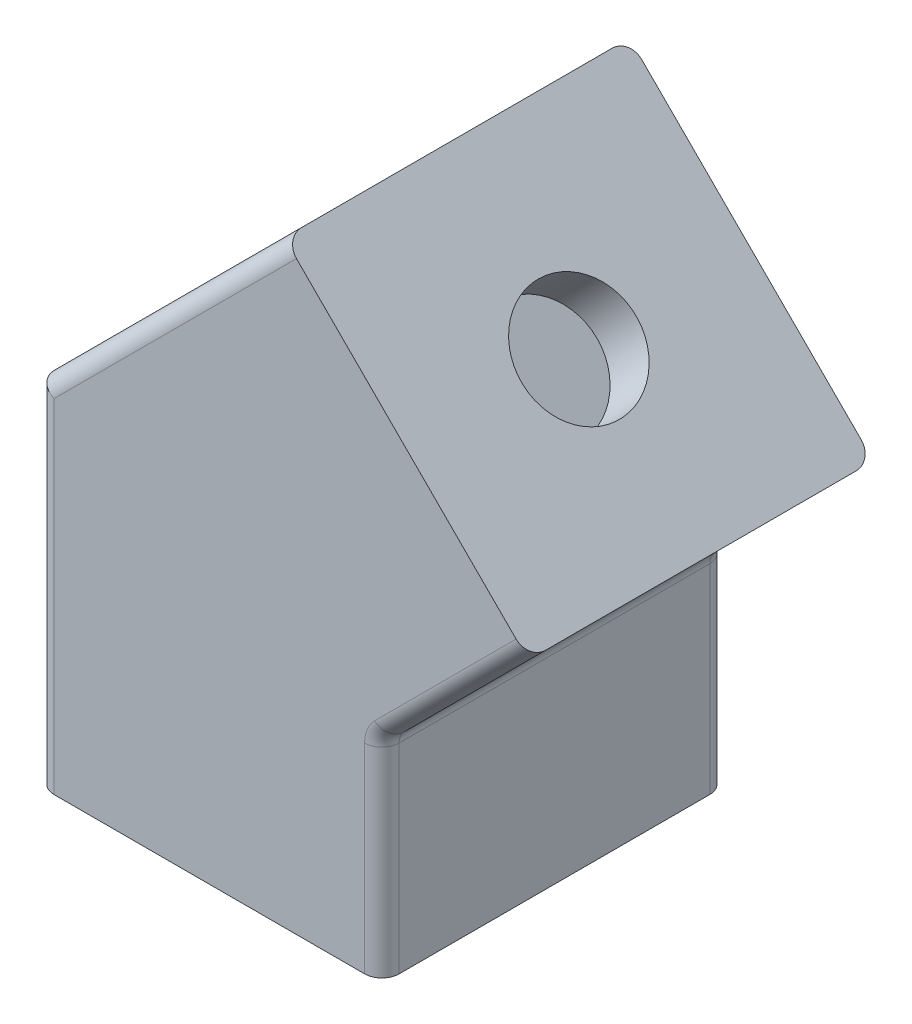
ISO-10303-21;
HEADER;
FILE_DESCRIPTION(('STEP AP214'),'2;1');
FILE_NAME('part.step','',(''),(''),'','','');
FILE_SCHEMA(('AUTOMOTIVE_DESIGN { 1 0 10303 214 1 1 1 1 }'));
ENDSEC;
DATA;
#1=APPLICATION_CONTEXT('core data for automotive mechanical design processes');
#2=APPLICATION_PROTOCOL_DEFINITION('international standard','automotive_design',2000,#1);
#3=PRODUCT_CONTEXT('',#1,'mechanical');
#4=PRODUCT('Part','Part','',(#3));
#5=PRODUCT_RELATED_PRODUCT_CATEGORY('part','',(#4));
#6=PRODUCT_DEFINITION_FORMATION('','',#4);
#7=PRODUCT_DEFINITION_CONTEXT('part definition',#1,'design');
#8=PRODUCT_DEFINITION('design','',#6,#7);
#9=PRODUCT_DEFINITION_SHAPE('','',#8);
#10=(LENGTH_UNIT() NAMED_UNIT(*) SI_UNIT(.MILLI.,.METRE.));
#11=(NAMED_UNIT(*) PLANE_ANGLE_UNIT() SI_UNIT($,.RADIAN.));
#12=(NAMED_UNIT(*) SI_UNIT($,.STERADIAN.) SOLID_ANGLE_UNIT());
#13=UNCERTAINTY_MEASURE_WITH_UNIT(LENGTH_MEASURE(1.E-05),#10,'distance_accuracy_value','');
#14=(GEOMETRIC_REPRESENTATION_CONTEXT(3) GLOBAL_UNCERTAINTY_ASSIGNED_CONTEXT((#13)) GLOBAL_UNIT_ASSIGNED_CONTEXT((#10,
#11,#12)) REPRESENTATION_CONTEXT('',''));
#15=CARTESIAN_POINT('',(0.,0.,0.));
#16=DIRECTION('',(0.,0.,1.));
#17=DIRECTION('',(1.,0.,0.));
#18=AXIS2_PLACEMENT_3D('',#15,#16,#17);
#19=CARTESIAN_POINT('',(-11.3137084989846,45.2548339959391,20.));
#20=DIRECTION('',(0.707106781186546,-0.707106781186549,0.));
#21=DIRECTION('',(0.707106781186549,0.707106781186546,0.));
#22=AXIS2_PLACEMENT_3D('',#19,#20,#21);
#23=PLANE('',#22);
#24=DIRECTION('',(0.,0.,-1.));
#25=VECTOR('',#24,1.);
#26=CARTESIAN_POINT('',(-40.,16.5685424949239,20.));
#27=LINE('',#26,#25);
#28=CARTESIAN_POINT('',(-40.,16.5685424949239,18.));
#29=VERTEX_POINT('',#28);
#30=CARTESIAN_POINT('',(-40.,16.5685424949239,16.7));
#31=VERTEX_POINT('',#30);
#32=EDGE_CURVE('E281',#29,#31,#27,.T.);
#33=ORIENTED_EDGE('',*,*,#32,.F.);
#34=DIRECTION('',(-0.707106781186549,-0.707106781186546,0.));
#35=VECTOR('',#34,1.);
#36=CARTESIAN_POINT('',(-11.3137084989846,45.2548339959391,18.));
#37=LINE('',#36,#35);
#38=CARTESIAN_POINT('',(-11.3137084989846,45.2548339959391,18.));
#39=VERTEX_POINT('',#38);
#40=EDGE_CURVE('E359',#29,#39,#37,.F.);
#41=ORIENTED_EDGE('',*,*,#40,.T.);
#42=DIRECTION('',(0.,0.,-1.));
#43=VECTOR('',#42,1.);
#44=CARTESIAN_POINT('',(-11.3137084989846,45.2548339959391,20.));
#45=LINE('',#44,#43);
#46=CARTESIAN_POINT('',(-11.3137084989846,45.2548339959391,-18.));
#47=VERTEX_POINT('',#46);
#48=EDGE_CURVE('E284',#39,#47,#45,.T.);
#49=ORIENTED_EDGE('',*,*,#48,.T.);
#50=DIRECTION('',(-0.707106781186549,-0.707106781186546,0.));
#51=VECTOR('',#50,1.);
#52=CARTESIAN_POINT('',(-11.3137084989846,45.2548339959391,-18.));
#53=LINE('',#52,#51);
#54=CARTESIAN_POINT('',(-40.,16.5685424949239,-18.));
#55=VERTEX_POINT('',#54);
#56=EDGE_CURVE('E355',#47,#55,#53,.T.);
#57=ORIENTED_EDGE('',*,*,#56,.T.);
#58=CARTESIAN_POINT('',(-40.,16.5685424949239,-16.7));
#59=VERTEX_POINT('',#58);
#60=EDGE_CURVE('E280',#59,#55,#27,.T.);
#61=ORIENTED_EDGE('',*,*,#60,.F.);
#62=DIRECTION('',(-0.707106781186549,-0.707106781186546,0.));
#63=VECTOR('',#62,1.);
#64=CARTESIAN_POINT('',(-11.3137084989846,45.2548339959391,-16.7));
#65=LINE('',#64,#63);
#66=CARTESIAN_POINT('',(-15.8391918985786,40.7293505963452,-16.7));
#67=VERTEX_POINT('',#66);
#68=EDGE_CURVE('E240',#67,#59,#65,.T.);
#69=ORIENTED_EDGE('',*,*,#68,.F.);
#70=DIRECTION('',(0.,0.,-1.));
#71=VECTOR('',#70,1.);
#72=CARTESIAN_POINT('',(-15.8391918985786,40.7293505963452,20.));
#73=LINE('',#72,#71);
#74=CARTESIAN_POINT('',(-15.8391918985786,40.7293505963452,16.7));
#75=VERTEX_POINT('',#74);
#76=EDGE_CURVE('E234',#75,#67,#73,.T.);
#77=ORIENTED_EDGE('',*,*,#76,.F.);
#78=DIRECTION('',(-0.707106781186549,-0.707106781186546,0.));
#79=VECTOR('',#78,1.);
#80=CARTESIAN_POINT('',(-11.3137084989846,45.2548339959391,16.7));
#81=LINE('',#80,#79);
#82=EDGE_CURVE('E243',#75,#31,#81,.T.);
#83=ORIENTED_EDGE('',*,*,#82,.T.);
#84=EDGE_LOOP('',(#33,#41,#49,#57,#61,#69,#77,#83));
#85=FACE_BOUND('',#84,.T.);
#86=ADVANCED_FACE('F41',(#85),#23,.F.);
#87=CARTESIAN_POINT('',(-40.,16.5685424949239,20.));
#88=DIRECTION('',(1.,0.,0.));
#89=DIRECTION('',(0.,0.,-1.));
#90=AXIS2_PLACEMENT_3D('',#87,#88,#89);
#91=PLANE('',#90);
#92=DIRECTION('',(0.,0.,-1.));
#93=VECTOR('',#92,1.);
#94=CARTESIAN_POINT('',(-40.,-24.,20.));
#95=LINE('',#94,#93);
#96=CARTESIAN_POINT('',(-40.,-24.,18.));
#97=VERTEX_POINT('',#96);
#98=CARTESIAN_POINT('',(-40.,-24.,-18.));
#99=VERTEX_POINT('',#98);
#100=EDGE_CURVE('E270',#97,#99,#95,.T.);
#101=ORIENTED_EDGE('',*,*,#100,.F.);
#102=DIRECTION('',(0.,-1.,0.));
#103=VECTOR('',#102,1.);
#104=CARTESIAN_POINT('',(-40.,16.5685424949239,18.));
#105=LINE('',#104,#103);
#106=EDGE_CURVE('E377',#97,#29,#105,.F.);
#107=ORIENTED_EDGE('',*,*,#106,.T.);
#108=ORIENTED_EDGE('',*,*,#32,.T.);
#109=DIRECTION('',(0.,-1.,0.));
#110=VECTOR('',#109,1.);
#111=CARTESIAN_POINT('',(-40.,16.5685424949239,16.7));
#112=LINE('',#111,#110);
#113=CARTESIAN_POINT('',(-40.,-14.,16.7));
#114=VERTEX_POINT('',#113);
#115=EDGE_CURVE('E247',#31,#114,#112,.T.);
#116=ORIENTED_EDGE('',*,*,#115,.T.);
#117=DIRECTION('',(0.,0.,-1.));
#118=VECTOR('',#117,1.);
#119=CARTESIAN_POINT('',(-40.,-14.,20.));
#120=LINE('',#119,#118);
#121=CARTESIAN_POINT('',(-40.,-14.,-16.7));
#122=VERTEX_POINT('',#121);
#123=EDGE_CURVE('E244',#114,#122,#120,.T.);
#124=ORIENTED_EDGE('',*,*,#123,.T.);
#125=DIRECTION('',(0.,-1.,0.));
#126=VECTOR('',#125,1.);
#127=CARTESIAN_POINT('',(-40.,16.5685424949239,-16.7));
#128=LINE('',#127,#126);
#129=EDGE_CURVE('E212',#59,#122,#128,.T.);
#130=ORIENTED_EDGE('',*,*,#129,.F.);
#131=ORIENTED_EDGE('',*,*,#60,.T.);
#132=DIRECTION('',(0.,-1.,0.));
#133=VECTOR('',#132,1.);
#134=CARTESIAN_POINT('',(-40.,16.5685424949239,-18.));
#135=LINE('',#134,#133);
#136=EDGE_CURVE('E374',#55,#99,#135,.T.);
#137=ORIENTED_EDGE('',*,*,#136,.T.);
#138=EDGE_LOOP('',(#101,#107,#108,#116,#124,#130,#131,#137));
#139=FACE_BOUND('',#138,.T.);
#140=ADVANCED_FACE('F439',(#139),#91,.F.);
#141=CARTESIAN_POINT('',(-40.,-24.,20.));
#142=DIRECTION('',(0.,1.,0.));
#143=DIRECTION('',(0.,0.,1.));
#144=AXIS2_PLACEMENT_3D('',#141,#142,#143);
#145=PLANE('',#144);
#146=CARTESIAN_POINT('',(-20.,-24.,0.));
#147=DIRECTION('',(0.,-1.,0.));
#148=DIRECTION('',(0.,0.,-1.));
#149=AXIS2_PLACEMENT_3D('',#146,#147,#148);
#150=CIRCLE('',#149,6.65);
#151=CARTESIAN_POINT('',(-20.,-24.,-6.65));
#152=VERTEX_POINT('',#151);
#153=EDGE_CURVE('E214',#152,#152,#150,.T.);
#154=ORIENTED_EDGE('',*,*,#153,.F.);
#155=EDGE_LOOP('',(#154));
#156=FACE_BOUND('',#155,.T.);
#157=DIRECTION('',(1.,0.,0.));
#158=VECTOR('',#157,1.);
#159=CARTESIAN_POINT('',(-40.,-24.,20.));
#160=LINE('',#159,#158);
#161=CARTESIAN_POINT('',(-38.,-24.,20.));
#162=VERTEX_POINT('',#161);
#163=CARTESIAN_POINT('',(-2.,-24.,20.));
#164=VERTEX_POINT('',#163);
#165=EDGE_CURVE('E261',#162,#164,#160,.T.);
#166=ORIENTED_EDGE('',*,*,#165,.F.);
#167=CARTESIAN_POINT('',(-38.,-24.,18.));
#168=DIRECTION('',(0.,1.,0.));
#169=DIRECTION('',(0.,0.,1.));
#170=AXIS2_PLACEMENT_3D('',#167,#168,#169);
#171=CIRCLE('',#170,2.);
#172=EDGE_CURVE('E371',#162,#97,#171,.F.);
#173=ORIENTED_EDGE('',*,*,#172,.T.);
#174=ORIENTED_EDGE('',*,*,#100,.T.);
#175=CARTESIAN_POINT('',(-38.,-24.,-18.));
#176=DIRECTION('',(0.,1.,0.));
#177=DIRECTION('',(0.,0.,1.));
#178=AXIS2_PLACEMENT_3D('',#175,#176,#177);
#179=CIRCLE('',#178,2.);
#180=CARTESIAN_POINT('',(-38.,-24.,-20.));
#181=VERTEX_POINT('',#180);
#182=EDGE_CURVE('E368',#99,#181,#179,.F.);
#183=ORIENTED_EDGE('',*,*,#182,.T.);
#184=DIRECTION('',(1.,0.,0.));
#185=VECTOR('',#184,1.);
#186=CARTESIAN_POINT('',(-40.,-24.,-20.));
#187=LINE('',#186,#185);
#188=CARTESIAN_POINT('',(-2.,-24.,-20.));
#189=VERTEX_POINT('',#188);
#190=EDGE_CURVE('E207',#181,#189,#187,.T.);
#191=ORIENTED_EDGE('',*,*,#190,.T.);
#192=CARTESIAN_POINT('',(-2.,-24.,-18.));
#193=DIRECTION('',(0.,1.,0.));
#194=DIRECTION('',(0.,0.,1.));
#195=AXIS2_PLACEMENT_3D('',#192,#193,#194);
#196=CIRCLE('',#195,2.);
#197=CARTESIAN_POINT('',(0.,-24.,-18.));
#198=VERTEX_POINT('',#197);
#199=EDGE_CURVE('E365',#189,#198,#196,.F.);
#200=ORIENTED_EDGE('',*,*,#199,.T.);
#201=DIRECTION('',(0.,0.,-1.));
#202=VECTOR('',#201,1.);
#203=CARTESIAN_POINT('',(0.,-24.,20.));
#204=LINE('',#203,#202);
#205=CARTESIAN_POINT('',(0.,-24.,18.));
#206=VERTEX_POINT('',#205);
#207=EDGE_CURVE('E292',#206,#198,#204,.T.);
#208=ORIENTED_EDGE('',*,*,#207,.F.);
#209=CARTESIAN_POINT('',(-2.,-24.,18.));
#210=DIRECTION('',(0.,1.,0.));
#211=DIRECTION('',(0.,0.,1.));
#212=AXIS2_PLACEMENT_3D('',#209,#210,#211);
#213=CIRCLE('',#212,2.);
#214=EDGE_CURVE('E362',#206,#164,#213,.F.);
#215=ORIENTED_EDGE('',*,*,#214,.T.);
#216=EDGE_LOOP('',(#166,#173,#174,#183,#191,#200,#208,#215));
#217=FACE_BOUND('',#216,.T.);
#218=ADVANCED_FACE('F473',(#156,#217),#145,.F.);
#219=CARTESIAN_POINT('',(0.,-24.,20.));
#220=DIRECTION('',(-1.,0.,0.));
#221=DIRECTION('',(0.,0.,1.));
#222=AXIS2_PLACEMENT_3D('',#219,#220,#221);
#223=PLANE('',#222);
#224=ORIENTED_EDGE('',*,*,#207,.T.);
#225=DIRECTION('',(0.,1.,0.));
#226=VECTOR('',#225,1.);
#227=CARTESIAN_POINT('',(0.,-24.,-18.));
#228=LINE('',#227,#226);
#229=CARTESIAN_POINT('',(0.,-0.828427124746193,-18.));
#230=VERTEX_POINT('',#229);
#231=EDGE_CURVE('E59',#198,#230,#228,.T.);
#232=ORIENTED_EDGE('',*,*,#231,.T.);
#233=DIRECTION('',(0.,0.,-1.));
#234=VECTOR('',#233,1.);
#235=CARTESIAN_POINT('',(0.,-0.828427124746193,20.));
#236=LINE('',#235,#234);
#237=CARTESIAN_POINT('',(0.,-0.828427124746193,18.));
#238=VERTEX_POINT('',#237);
#239=EDGE_CURVE('E63',#230,#238,#236,.F.);
#240=ORIENTED_EDGE('',*,*,#239,.T.);
#241=DIRECTION('',(0.,1.,0.));
#242=VECTOR('',#241,1.);
#243=CARTESIAN_POINT('',(0.,-24.,18.));
#244=LINE('',#243,#242);
#245=EDGE_CURVE('E380',#238,#206,#244,.F.);
#246=ORIENTED_EDGE('',*,*,#245,.T.);
#247=EDGE_LOOP('',(#224,#232,#240,#246));
#248=FACE_BOUND('',#247,.T.);
#249=ADVANCED_FACE('F485',(#248),#223,.F.);
#250=CARTESIAN_POINT('',(0.,0.,20.));
#251=DIRECTION('',(-0.707106781186545,0.70710678118655,0.));
#252=DIRECTION('',(-0.70710678118655,-0.707106781186545,0.));
#253=AXIS2_PLACEMENT_3D('',#250,#251,#252);
#254=PLANE('',#253);
#255=DIRECTION('',(0.,0.,-1.));
#256=VECTOR('',#255,1.);
#257=CARTESIAN_POINT('',(0.58578643762691,0.585786437626906,-20.));
#258=LINE('',#257,#256);
#259=CARTESIAN_POINT('',(0.585786437626909,0.585786437626906,18.));
#260=VERTEX_POINT('',#259);
#261=CARTESIAN_POINT('',(0.585786437626909,0.585786437626906,-18.));
#262=VERTEX_POINT('',#261);
#263=EDGE_CURVE('E298',#260,#262,#258,.T.);
#264=ORIENTED_EDGE('',*,*,#263,.T.);
#265=DIRECTION('',(0.70710678118655,0.707106781186545,0.));
#266=VECTOR('',#265,1.);
#267=CARTESIAN_POINT('',(0.,0.,-18.));
#268=LINE('',#267,#266);
#269=CARTESIAN_POINT('',(16.9705627484772,16.9705627484771,-18.));
#270=VERTEX_POINT('',#269);
#271=EDGE_CURVE('E301',#262,#270,#268,.T.);
#272=ORIENTED_EDGE('',*,*,#271,.T.);
#273=DIRECTION('',(0.,0.,-1.));
#274=VECTOR('',#273,1.);
#275=CARTESIAN_POINT('',(16.9705627484772,16.9705627484771,20.));
#276=LINE('',#275,#274);
#277=CARTESIAN_POINT('',(16.9705627484772,16.9705627484771,18.));
#278=VERTEX_POINT('',#277);
#279=EDGE_CURVE('E288',#278,#270,#276,.T.);
#280=ORIENTED_EDGE('',*,*,#279,.F.);
#281=DIRECTION('',(0.70710678118655,0.707106781186545,0.));
#282=VECTOR('',#281,1.);
#283=CARTESIAN_POINT('',(0.,0.,18.));
#284=LINE('',#283,#282);
#285=EDGE_CURVE('E295',#278,#260,#284,.F.);
#286=ORIENTED_EDGE('',*,*,#285,.T.);
#287=EDGE_LOOP('',(#264,#272,#280,#286));
#288=FACE_BOUND('',#287,.T.);
#289=ADVANCED_FACE('F481',(#288),#254,.F.);
#290=CARTESIAN_POINT('',(16.9705627484772,16.9705627484771,20.));
#291=DIRECTION('',(-0.707106781186549,-0.707106781186546,0.));
#292=DIRECTION('',(0.707106781186546,-0.707106781186549,0.));
#293=AXIS2_PLACEMENT_3D('',#290,#291,#292);
#294=PLANE('',#293);
#295=CARTESIAN_POINT('',(2.82842712474628,31.1126983722081,0.));
#296=DIRECTION('',(0.707106781186549,0.707106781186546,0.));
#297=DIRECTION('',(-0.707106781186546,0.707106781186549,0.));
#298=AXIS2_PLACEMENT_3D('',#295,#296,#297);
#299=CIRCLE('',#298,6.65);
#300=CARTESIAN_POINT('',(-1.87383297014426,35.8149584670986,0.));
#301=VERTEX_POINT('',#300);
#302=EDGE_CURVE('E720',#301,#301,#299,.T.);
#303=ORIENTED_EDGE('',*,*,#302,.F.);
#304=EDGE_LOOP('',(#303));
#305=FACE_BOUND('',#304,.T.);
#306=ORIENTED_EDGE('',*,*,#279,.T.);
#307=CARTESIAN_POINT('',(15.5563491861041,18.3847763108502,-18.));
#308=DIRECTION('',(-0.707106781186549,-0.707106781186546,0.));
#309=DIRECTION('',(0.707106781186546,-0.707106781186549,0.));
#310=AXIS2_PLACEMENT_3D('',#307,#308,#309);
#311=CIRCLE('',#310,2.);
#312=CARTESIAN_POINT('',(15.5563491861041,18.3847763108502,-20.));
#313=VERTEX_POINT('',#312);
#314=EDGE_CURVE('E314',#270,#313,#311,.F.);
#315=ORIENTED_EDGE('',*,*,#314,.T.);
#316=DIRECTION('',(-0.707106781186546,0.707106781186549,0.));
#317=VECTOR('',#316,1.);
#318=CARTESIAN_POINT('',(16.9705627484772,16.9705627484771,-20.));
#319=LINE('',#318,#317);
#320=CARTESIAN_POINT('',(-9.89949493661156,43.840620433566,-20.));
#321=VERTEX_POINT('',#320);
#322=EDGE_CURVE('E266',#313,#321,#319,.T.);
#323=ORIENTED_EDGE('',*,*,#322,.T.);
#324=CARTESIAN_POINT('',(-9.89949493661156,43.840620433566,-18.));
#325=DIRECTION('',(-0.707106781186549,-0.707106781186546,0.));
#326=DIRECTION('',(0.707106781186546,-0.707106781186549,0.));
#327=AXIS2_PLACEMENT_3D('',#324,#325,#326);
#328=CIRCLE('',#327,2.);
#329=EDGE_CURVE('E308',#321,#47,#328,.F.);
#330=ORIENTED_EDGE('',*,*,#329,.T.);
#331=ORIENTED_EDGE('',*,*,#48,.F.);
#332=CARTESIAN_POINT('',(-9.89949493661156,43.840620433566,18.));
#333=DIRECTION('',(-0.707106781186549,-0.707106781186546,0.));
#334=DIRECTION('',(0.707106781186546,-0.707106781186549,0.));
#335=AXIS2_PLACEMENT_3D('',#332,#333,#334);
#336=CIRCLE('',#335,2.);
#337=CARTESIAN_POINT('',(-9.89949493661156,43.840620433566,20.));
#338=VERTEX_POINT('',#337);
#339=EDGE_CURVE('E311',#39,#338,#336,.F.);
#340=ORIENTED_EDGE('',*,*,#339,.T.);
#341=DIRECTION('',(-0.707106781186546,0.707106781186549,0.));
#342=VECTOR('',#341,1.);
#343=CARTESIAN_POINT('',(16.9705627484772,16.9705627484771,20.));
#344=LINE('',#343,#342);
#345=CARTESIAN_POINT('',(15.5563491861041,18.3847763108502,20.));
#346=VERTEX_POINT('',#345);
#347=EDGE_CURVE('E265',#346,#338,#344,.T.);
#348=ORIENTED_EDGE('',*,*,#347,.F.);
#349=CARTESIAN_POINT('',(15.5563491861041,18.3847763108502,18.));
#350=DIRECTION('',(-0.707106781186549,-0.707106781186546,0.));
#351=DIRECTION('',(0.707106781186546,-0.707106781186549,0.));
#352=AXIS2_PLACEMENT_3D('',#349,#350,#351);
#353=CIRCLE('',#352,2.);
#354=EDGE_CURVE('E305',#346,#278,#353,.F.);
#355=ORIENTED_EDGE('',*,*,#354,.T.);
#356=EDGE_LOOP('',(#306,#315,#323,#330,#331,#340,#348,#355));
#357=FACE_BOUND('',#356,.T.);
#358=ADVANCED_FACE('F477',(#305,#357),#294,.F.);
#359=CARTESIAN_POINT('',(0.,0.,20.));
#360=DIRECTION('',(0.,0.,1.));
#361=DIRECTION('',(1.,0.,0.));
#362=AXIS2_PLACEMENT_3D('',#359,#360,#361);
#363=PLANE('',#362);
#364=ORIENTED_EDGE('',*,*,#347,.T.);
#365=DIRECTION('',(-0.707106781186549,-0.707106781186546,0.));
#366=VECTOR('',#365,1.);
#367=CARTESIAN_POINT('',(-38.5857864376269,15.1543289325508,20.));
#368=LINE('',#367,#366);
#369=CARTESIAN_POINT('',(-38.,15.7401153701777,20.));
#370=VERTEX_POINT('',#369);
#371=EDGE_CURVE('E351',#338,#370,#368,.T.);
#372=ORIENTED_EDGE('',*,*,#371,.T.);
#373=DIRECTION('',(0.,-1.,0.));
#374=VECTOR('',#373,1.);
#375=CARTESIAN_POINT('',(-38.,-24.,20.));
#376=LINE('',#375,#374);
#377=EDGE_CURVE('E348',#370,#162,#376,.T.);
#378=ORIENTED_EDGE('',*,*,#377,.T.);
#379=ORIENTED_EDGE('',*,*,#165,.T.);
#380=DIRECTION('',(0.,1.,0.));
#381=VECTOR('',#380,1.);
#382=CARTESIAN_POINT('',(-2.,0.,20.));
#383=LINE('',#382,#381);
#384=CARTESIAN_POINT('',(-2.,-0.828427124746193,20.));
#385=VERTEX_POINT('',#384);
#386=EDGE_CURVE('E345',#164,#385,#383,.T.);
#387=ORIENTED_EDGE('',*,*,#386,.T.);
#388=CARTESIAN_POINT('',(2.,-0.828427124746193,20.));
#389=DIRECTION('',(0.,0.,1.));
#390=DIRECTION('',(1.,0.,0.));
#391=AXIS2_PLACEMENT_3D('',#388,#389,#390);
#392=CIRCLE('',#391,4.);
#393=CARTESIAN_POINT('',(-0.828427124746182,2.00000000000001,20.));
#394=VERTEX_POINT('',#393);
#395=EDGE_CURVE('E341',#394,#385,#392,.T.);
#396=ORIENTED_EDGE('',*,*,#395,.F.);
#397=DIRECTION('',(0.70710678118655,0.707106781186545,0.));
#398=VECTOR('',#397,1.);
#399=CARTESIAN_POINT('',(15.5563491861041,18.3847763108502,20.));
#400=LINE('',#399,#398);
#401=EDGE_CURVE('E338',#394,#346,#400,.T.);
#402=ORIENTED_EDGE('',*,*,#401,.T.);
#403=EDGE_LOOP('',(#364,#372,#378,#379,#387,#396,#402));
#404=FACE_BOUND('',#403,.T.);
#405=ADVANCED_FACE('F480',(#404),#363,.T.);
#406=CARTESIAN_POINT('',(0.,0.,-20.));
#407=DIRECTION('',(0.,0.,1.));
#408=DIRECTION('',(1.,0.,0.));
#409=AXIS2_PLACEMENT_3D('',#406,#407,#408);
#410=PLANE('',#409);
#411=DIRECTION('',(0.,-1.,0.));
#412=VECTOR('',#411,1.);
#413=CARTESIAN_POINT('',(-38.,0.,-20.));
#414=LINE('',#413,#412);
#415=CARTESIAN_POINT('',(-38.,15.7401153701777,-20.));
#416=VERTEX_POINT('',#415);
#417=EDGE_CURVE('E327',#181,#416,#414,.F.);
#418=ORIENTED_EDGE('',*,*,#417,.T.);
#419=DIRECTION('',(-0.707106781186549,-0.707106781186546,0.));
#420=VECTOR('',#419,1.);
#421=CARTESIAN_POINT('',(-26.8700576850887,26.8700576850889,-20.));
#422=LINE('',#421,#420);
#423=EDGE_CURVE('E330',#416,#321,#422,.F.);
#424=ORIENTED_EDGE('',*,*,#423,.T.);
#425=ORIENTED_EDGE('',*,*,#322,.F.);
#426=DIRECTION('',(0.70710678118655,0.707106781186545,0.));
#427=VECTOR('',#426,1.);
#428=CARTESIAN_POINT('',(-1.41421356237309,1.4142135623731,-20.));
#429=LINE('',#428,#427);
#430=CARTESIAN_POINT('',(-0.828427124746181,2.,-20.));
#431=VERTEX_POINT('',#430);
#432=EDGE_CURVE('E324',#313,#431,#429,.F.);
#433=ORIENTED_EDGE('',*,*,#432,.T.);
#434=CARTESIAN_POINT('',(2.,-0.828427124746193,-20.));
#435=DIRECTION('',(0.,0.,1.));
#436=DIRECTION('',(1.,0.,0.));
#437=AXIS2_PLACEMENT_3D('',#434,#435,#436);
#438=CIRCLE('',#437,4.);
#439=CARTESIAN_POINT('',(-2.,-0.828427124746193,-20.));
#440=VERTEX_POINT('',#439);
#441=EDGE_CURVE('E320',#440,#431,#438,.F.);
#442=ORIENTED_EDGE('',*,*,#441,.F.);
#443=DIRECTION('',(0.,1.,0.));
#444=VECTOR('',#443,1.);
#445=CARTESIAN_POINT('',(-2.,0.,-20.));
#446=LINE('',#445,#444);
#447=EDGE_CURVE('E317',#440,#189,#446,.F.);
#448=ORIENTED_EDGE('',*,*,#447,.T.);
#449=ORIENTED_EDGE('',*,*,#190,.F.);
#450=EDGE_LOOP('',(#418,#424,#425,#433,#442,#448,#449));
#451=FACE_BOUND('',#450,.T.);
#452=ADVANCED_FACE('F662',(#451),#410,.F.);
#453=CARTESIAN_POINT('',(-40.,-14.,20.));
#454=DIRECTION('',(0.,1.,0.));
#455=DIRECTION('',(0.,0.,1.));
#456=AXIS2_PLACEMENT_3D('',#453,#454,#455);
#457=PLANE('',#456);
#458=CARTESIAN_POINT('',(-20.,-14.,0.));
#459=DIRECTION('',(0.,1.,0.));
#460=DIRECTION('',(0.,0.,1.));
#461=AXIS2_PLACEMENT_3D('',#458,#459,#460);
#462=CIRCLE('',#461,6.65);
#463=CARTESIAN_POINT('',(-20.,-14.,6.65));
#464=VERTEX_POINT('',#463);
#465=EDGE_CURVE('E218',#464,#464,#462,.F.);
#466=ORIENTED_EDGE('',*,*,#465,.T.);
#467=EDGE_LOOP('',(#466));
#468=FACE_BOUND('',#467,.T.);
#469=DIRECTION('',(1.,0.,0.));
#470=VECTOR('',#469,1.);
#471=CARTESIAN_POINT('',(-40.,-14.,-16.7));
#472=LINE('',#471,#470);
#473=CARTESIAN_POINT('',(-3.3,-14.,-16.7));
#474=VERTEX_POINT('',#473);
#475=EDGE_CURVE('E197',#122,#474,#472,.T.);
#476=ORIENTED_EDGE('',*,*,#475,.F.);
#477=ORIENTED_EDGE('',*,*,#123,.F.);
#478=DIRECTION('',(1.,0.,0.));
#479=VECTOR('',#478,1.);
#480=CARTESIAN_POINT('',(-40.,-14.,16.7));
#481=LINE('',#480,#479);
#482=CARTESIAN_POINT('',(-3.3,-14.,16.7));
#483=VERTEX_POINT('',#482);
#484=EDGE_CURVE('E205',#114,#483,#481,.T.);
#485=ORIENTED_EDGE('',*,*,#484,.T.);
#486=DIRECTION('',(0.,0.,-1.));
#487=VECTOR('',#486,1.);
#488=CARTESIAN_POINT('',(-3.3,-14.,20.));
#489=LINE('',#488,#487);
#490=EDGE_CURVE('E190',#483,#474,#489,.T.);
#491=ORIENTED_EDGE('',*,*,#490,.T.);
#492=EDGE_LOOP('',(#476,#477,#485,#491));
#493=FACE_BOUND('',#492,.T.);
#494=ADVANCED_FACE('F202',(#468,#493),#457,.T.);
#495=CARTESIAN_POINT('',(-3.3,-24.,20.));
#496=DIRECTION('',(-1.,0.,0.));
#497=DIRECTION('',(0.,0.,1.));
#498=AXIS2_PLACEMENT_3D('',#495,#496,#497);
#499=PLANE('',#498);
#500=DIRECTION('',(0.,1.,0.));
#501=VECTOR('',#500,1.);
#502=CARTESIAN_POINT('',(-3.3,-24.,16.7));
#503=LINE('',#502,#501);
#504=CARTESIAN_POINT('',(-3.3,0.538477631085024,16.7));
#505=VERTEX_POINT('',#504);
#506=EDGE_CURVE('E223',#483,#505,#503,.T.);
#507=ORIENTED_EDGE('',*,*,#506,.T.);
#508=DIRECTION('',(0.,0.,-1.));
#509=VECTOR('',#508,1.);
#510=CARTESIAN_POINT('',(-3.3,0.538477631085024,20.));
#511=LINE('',#510,#509);
#512=CARTESIAN_POINT('',(-3.3,0.538477631085024,-16.7));
#513=VERTEX_POINT('',#512);
#514=EDGE_CURVE('E192',#505,#513,#511,.T.);
#515=ORIENTED_EDGE('',*,*,#514,.T.);
#516=DIRECTION('',(0.,1.,0.));
#517=VECTOR('',#516,1.);
#518=CARTESIAN_POINT('',(-3.3,-24.,-16.7));
#519=LINE('',#518,#517);
#520=EDGE_CURVE('E186',#474,#513,#519,.T.);
#521=ORIENTED_EDGE('',*,*,#520,.F.);
#522=ORIENTED_EDGE('',*,*,#490,.F.);
#523=EDGE_LOOP('',(#507,#515,#521,#522));
#524=FACE_BOUND('',#523,.T.);
#525=ADVANCED_FACE('F189',(#524),#499,.T.);
#526=CARTESIAN_POINT('',(-2.3334523779156,2.33345237791561,20.));
#527=DIRECTION('',(-0.707106781186545,0.70710678118655,0.));
#528=DIRECTION('',(-0.70710678118655,-0.707106781186545,0.));
#529=AXIS2_PLACEMENT_3D('',#526,#527,#528);
#530=PLANE('',#529);
#531=DIRECTION('',(0.70710678118655,0.707106781186545,0.));
#532=VECTOR('',#531,1.);
#533=CARTESIAN_POINT('',(-2.3334523779156,2.33345237791561,-16.7));
#534=LINE('',#533,#532);
#535=CARTESIAN_POINT('',(-2.71421356237309,1.95269119345812,-16.7));
#536=VERTEX_POINT('',#535);
#537=CARTESIAN_POINT('',(10.1116269709677,14.7785317267988,-16.7));
#538=VERTEX_POINT('',#537);
#539=EDGE_CURVE('E196',#536,#538,#534,.T.);
#540=ORIENTED_EDGE('',*,*,#539,.F.);
#541=DIRECTION('',(0.,0.,-1.));
#542=VECTOR('',#541,1.);
#543=CARTESIAN_POINT('',(-2.71421356237309,1.95269119345812,20.));
#544=LINE('',#543,#542);
#545=CARTESIAN_POINT('',(-2.71421356237309,1.95269119345812,16.7));
#546=VERTEX_POINT('',#545);
#547=EDGE_CURVE('E335',#536,#546,#544,.F.);
#548=ORIENTED_EDGE('',*,*,#547,.T.);
#549=DIRECTION('',(0.70710678118655,0.707106781186545,0.));
#550=VECTOR('',#549,1.);
#551=CARTESIAN_POINT('',(-2.3334523779156,2.33345237791561,16.7));
#552=LINE('',#551,#550);
#553=CARTESIAN_POINT('',(10.1116269709677,14.7785317267988,16.7));
#554=VERTEX_POINT('',#553);
#555=EDGE_CURVE('E227',#546,#554,#552,.T.);
#556=ORIENTED_EDGE('',*,*,#555,.T.);
#557=DIRECTION('',(0.,0.,-1.));
#558=VECTOR('',#557,1.);
#559=CARTESIAN_POINT('',(10.1116269709677,14.7785317267988,20.));
#560=LINE('',#559,#558);
#561=EDGE_CURVE('E208',#554,#538,#560,.T.);
#562=ORIENTED_EDGE('',*,*,#561,.T.);
#563=EDGE_LOOP('',(#540,#548,#556,#562));
#564=FACE_BOUND('',#563,.T.);
#565=ADVANCED_FACE('F458',(#564),#530,.T.);
#566=CARTESIAN_POINT('',(12.4450793488833,12.4450793488832,20.));
#567=DIRECTION('',(-0.707106781186549,-0.707106781186546,0.));
#568=DIRECTION('',(0.707106781186546,-0.707106781186549,0.));
#569=AXIS2_PLACEMENT_3D('',#566,#567,#568);
#570=PLANE('',#569);
#571=CARTESIAN_POINT('',(-1.69705627484764,26.5872149726142,0.));
#572=DIRECTION('',(-0.707106781186549,-0.707106781186546,0.));
#573=DIRECTION('',(0.707106781186546,-0.707106781186549,0.));
#574=AXIS2_PLACEMENT_3D('',#571,#572,#573);
#575=CIRCLE('',#574,6.65);
#576=CARTESIAN_POINT('',(3.00520382004289,21.8849548777236,0.));
#577=VERTEX_POINT('',#576);
#578=EDGE_CURVE('E413',#577,#577,#575,.F.);
#579=ORIENTED_EDGE('',*,*,#578,.T.);
#580=EDGE_LOOP('',(#579));
#581=FACE_BOUND('',#580,.T.);
#582=DIRECTION('',(-0.707106781186546,0.707106781186549,0.));
#583=VECTOR('',#582,1.);
#584=CARTESIAN_POINT('',(12.4450793488833,12.4450793488832,-16.7));
#585=LINE('',#584,#583);
#586=EDGE_CURVE('E230',#538,#67,#585,.T.);
#587=ORIENTED_EDGE('',*,*,#586,.F.);
#588=ORIENTED_EDGE('',*,*,#561,.F.);
#589=DIRECTION('',(-0.707106781186546,0.707106781186549,0.));
#590=VECTOR('',#589,1.);
#591=CARTESIAN_POINT('',(12.4450793488833,12.4450793488832,16.7));
#592=LINE('',#591,#590);
#593=EDGE_CURVE('E237',#554,#75,#592,.T.);
#594=ORIENTED_EDGE('',*,*,#593,.T.);
#595=ORIENTED_EDGE('',*,*,#76,.T.);
#596=EDGE_LOOP('',(#587,#588,#594,#595));
#597=FACE_BOUND('',#596,.T.);
#598=ADVANCED_FACE('F449',(#581,#597),#570,.T.);
#599=CARTESIAN_POINT('',(0.,0.,16.7));
#600=DIRECTION('',(0.,0.,1.));
#601=DIRECTION('',(1.,0.,0.));
#602=AXIS2_PLACEMENT_3D('',#599,#600,#601);
#603=PLANE('',#602);
#604=ORIENTED_EDGE('',*,*,#484,.F.);
#605=ORIENTED_EDGE('',*,*,#115,.F.);
#606=ORIENTED_EDGE('',*,*,#82,.F.);
#607=ORIENTED_EDGE('',*,*,#593,.F.);
#608=ORIENTED_EDGE('',*,*,#555,.F.);
#609=CARTESIAN_POINT('',(-1.3,0.538477631085024,16.7));
#610=DIRECTION('',(0.,0.,1.));
#611=DIRECTION('',(1.,0.,0.));
#612=AXIS2_PLACEMENT_3D('',#609,#610,#611);
#613=CIRCLE('',#612,2.);
#614=EDGE_CURVE('E11',#546,#505,#613,.T.);
#615=ORIENTED_EDGE('',*,*,#614,.T.);
#616=ORIENTED_EDGE('',*,*,#506,.F.);
#617=EDGE_LOOP('',(#604,#605,#606,#607,#608,#615,#616));
#618=FACE_BOUND('',#617,.T.);
#619=ADVANCED_FACE('F444',(#618),#603,.F.);
#620=CARTESIAN_POINT('',(0.,0.,-16.7));
#621=DIRECTION('',(0.,0.,1.));
#622=DIRECTION('',(1.,0.,0.));
#623=AXIS2_PLACEMENT_3D('',#620,#621,#622);
#624=PLANE('',#623);
#625=ORIENTED_EDGE('',*,*,#475,.T.);
#626=ORIENTED_EDGE('',*,*,#520,.T.);
#627=CARTESIAN_POINT('',(-1.3,0.538477631085024,-16.7));
#628=DIRECTION('',(0.,0.,1.));
#629=DIRECTION('',(1.,0.,0.));
#630=AXIS2_PLACEMENT_3D('',#627,#628,#629);
#631=CIRCLE('',#630,2.);
#632=EDGE_CURVE('E51',#513,#536,#631,.F.);
#633=ORIENTED_EDGE('',*,*,#632,.T.);
#634=ORIENTED_EDGE('',*,*,#539,.T.);
#635=ORIENTED_EDGE('',*,*,#586,.T.);
#636=ORIENTED_EDGE('',*,*,#68,.T.);
#637=ORIENTED_EDGE('',*,*,#129,.T.);
#638=EDGE_LOOP('',(#625,#626,#633,#634,#635,#636,#637));
#639=FACE_BOUND('',#638,.T.);
#640=ADVANCED_FACE('F210',(#639),#624,.T.);
#641=CARTESIAN_POINT('',(-20.,45.2558339959391,0.));
#642=DIRECTION('',(0.,-1.,0.));
#643=DIRECTION('',(0.,0.,-1.));
#644=AXIS2_PLACEMENT_3D('',#641,#642,#643);
#645=CYLINDRICAL_SURFACE('',#644,6.65);
#646=ORIENTED_EDGE('',*,*,#465,.F.);
#647=EDGE_LOOP('',(#646));
#648=FACE_BOUND('',#647,.T.);
#649=ORIENTED_EDGE('',*,*,#153,.T.);
#650=EDGE_LOOP('',(#649));
#651=FACE_BOUND('',#650,.T.);
#652=ADVANCED_FACE('F582',(#648,#651),#645,.F.);
#653=CARTESIAN_POINT('',(-46.143135623731,-17.858864376269,0.));
#654=DIRECTION('',(0.707106781186549,0.707106781186546,0.));
#655=DIRECTION('',(-0.707106781186546,0.707106781186549,0.));
#656=AXIS2_PLACEMENT_3D('',#653,#654,#655);
#657=CYLINDRICAL_SURFACE('',#656,6.65);
#658=ORIENTED_EDGE('',*,*,#578,.F.);
#659=EDGE_LOOP('',(#658));
#660=FACE_BOUND('',#659,.T.);
#661=ORIENTED_EDGE('',*,*,#302,.T.);
#662=EDGE_LOOP('',(#661));
#663=FACE_BOUND('',#662,.T.);
#664=ADVANCED_FACE('F519',(#660,#663),#657,.F.);
#665=CARTESIAN_POINT('',(-2.,0.,18.));
#666=DIRECTION('',(0.,-1.,0.));
#667=DIRECTION('',(0.,0.,-1.));
#668=AXIS2_PLACEMENT_3D('',#665,#666,#667);
#669=CYLINDRICAL_SURFACE('',#668,2.);
#670=ORIENTED_EDGE('',*,*,#214,.F.);
#671=ORIENTED_EDGE('',*,*,#245,.F.);
#672=CARTESIAN_POINT('',(-2.,-0.828427124746193,18.));
#673=DIRECTION('',(0.,1.,0.));
#674=DIRECTION('',(0.,0.,1.));
#675=AXIS2_PLACEMENT_3D('',#672,#673,#674);
#676=CIRCLE('',#675,2.);
#677=EDGE_CURVE('E410',#385,#238,#676,.T.);
#678=ORIENTED_EDGE('',*,*,#677,.F.);
#679=ORIENTED_EDGE('',*,*,#386,.F.);
#680=EDGE_LOOP('',(#670,#671,#678,#679));
#681=FACE_BOUND('',#680,.T.);
#682=ADVANCED_FACE('F515',(#681),#669,.T.);
#683=CARTESIAN_POINT('',(-1.41421356237309,1.4142135623731,18.));
#684=DIRECTION('',(-0.70710678118655,-0.707106781186545,0.));
#685=DIRECTION('',(0.707106781186545,-0.70710678118655,0.));
#686=AXIS2_PLACEMENT_3D('',#683,#684,#685);
#687=CYLINDRICAL_SURFACE('',#686,2.);
#688=ORIENTED_EDGE('',*,*,#354,.F.);
#689=ORIENTED_EDGE('',*,*,#401,.F.);
#690=CARTESIAN_POINT('',(-0.828427124746182,2.00000000000001,18.));
#691=DIRECTION('',(-0.70710678118655,-0.707106781186545,0.));
#692=DIRECTION('',(0.707106781186545,-0.70710678118655,0.));
#693=AXIS2_PLACEMENT_3D('',#690,#691,#692);
#694=CIRCLE('',#693,2.);
#695=EDGE_CURVE('E406',#260,#394,#694,.T.);
#696=ORIENTED_EDGE('',*,*,#695,.F.);
#697=ORIENTED_EDGE('',*,*,#285,.F.);
#698=EDGE_LOOP('',(#688,#689,#696,#697));
#699=FACE_BOUND('',#698,.T.);
#700=ADVANCED_FACE('F511',(#699),#687,.T.);
#701=CARTESIAN_POINT('',(2.,-0.828427124746193,18.));
#702=DIRECTION('',(0.,0.,1.));
#703=DIRECTION('',(1.,0.,0.));
#704=AXIS2_PLACEMENT_3D('',#701,#702,#703);
#705=TOROIDAL_SURFACE('',#704,4.,2.);
#706=ORIENTED_EDGE('',*,*,#395,.T.);
#707=ORIENTED_EDGE('',*,*,#677,.T.);
#708=CARTESIAN_POINT('',(2.,-0.828427124746193,18.));
#709=DIRECTION('',(0.,0.,1.));
#710=DIRECTION('',(1.,0.,0.));
#711=AXIS2_PLACEMENT_3D('',#708,#709,#710);
#712=CIRCLE('',#711,2.);
#713=EDGE_CURVE('E402',#260,#238,#712,.T.);
#714=ORIENTED_EDGE('',*,*,#713,.F.);
#715=ORIENTED_EDGE('',*,*,#695,.T.);
#716=EDGE_LOOP('',(#706,#707,#714,#715));
#717=FACE_BOUND('',#716,.T.);
#718=ADVANCED_FACE('F507',(#717),#705,.T.);
#719=CARTESIAN_POINT('',(-2.,-24.,-18.));
#720=DIRECTION('',(0.,1.,0.));
#721=DIRECTION('',(0.,0.,1.));
#722=AXIS2_PLACEMENT_3D('',#719,#720,#721);
#723=CYLINDRICAL_SURFACE('',#722,2.);
#724=ORIENTED_EDGE('',*,*,#199,.F.);
#725=ORIENTED_EDGE('',*,*,#447,.F.);
#726=CARTESIAN_POINT('',(-2.,-0.828427124746193,-18.));
#727=DIRECTION('',(0.,1.,0.));
#728=DIRECTION('',(0.,0.,1.));
#729=AXIS2_PLACEMENT_3D('',#726,#727,#728);
#730=CIRCLE('',#729,2.);
#731=EDGE_CURVE('E398',#230,#440,#730,.T.);
#732=ORIENTED_EDGE('',*,*,#731,.F.);
#733=ORIENTED_EDGE('',*,*,#231,.F.);
#734=EDGE_LOOP('',(#724,#725,#732,#733));
#735=FACE_BOUND('',#734,.T.);
#736=ADVANCED_FACE('F503',(#735),#723,.T.);
#737=CARTESIAN_POINT('',(2.,-0.828427124746193,20.));
#738=DIRECTION('',(0.,0.,1.));
#739=DIRECTION('',(1.,0.,0.));
#740=AXIS2_PLACEMENT_3D('',#737,#738,#739);
#741=CYLINDRICAL_SURFACE('',#740,2.);
#742=ORIENTED_EDGE('',*,*,#713,.T.);
#743=ORIENTED_EDGE('',*,*,#239,.F.);
#744=CARTESIAN_POINT('',(2.,-0.828427124746193,-18.));
#745=DIRECTION('',(0.,0.,1.));
#746=DIRECTION('',(1.,0.,0.));
#747=AXIS2_PLACEMENT_3D('',#744,#745,#746);
#748=CIRCLE('',#747,2.);
#749=EDGE_CURVE('E393',#262,#230,#748,.T.);
#750=ORIENTED_EDGE('',*,*,#749,.F.);
#751=ORIENTED_EDGE('',*,*,#263,.F.);
#752=EDGE_LOOP('',(#742,#743,#750,#751));
#753=FACE_BOUND('',#752,.T.);
#754=ADVANCED_FACE('F499',(#753),#741,.F.);
#755=CARTESIAN_POINT('',(2.,-0.828427124746193,-18.));
#756=DIRECTION('',(0.,0.,1.));
#757=DIRECTION('',(1.,0.,0.));
#758=AXIS2_PLACEMENT_3D('',#755,#756,#757);
#759=TOROIDAL_SURFACE('',#758,4.,2.);
#760=ORIENTED_EDGE('',*,*,#731,.T.);
#761=ORIENTED_EDGE('',*,*,#441,.T.);
#762=CARTESIAN_POINT('',(-0.828427124746181,2.,-18.));
#763=DIRECTION('',(-0.70710678118655,-0.707106781186545,0.));
#764=DIRECTION('',(0.707106781186545,-0.70710678118655,0.));
#765=AXIS2_PLACEMENT_3D('',#762,#763,#764);
#766=CIRCLE('',#765,2.);
#767=EDGE_CURVE('E389',#262,#431,#766,.F.);
#768=ORIENTED_EDGE('',*,*,#767,.F.);
#769=ORIENTED_EDGE('',*,*,#749,.T.);
#770=EDGE_LOOP('',(#760,#761,#768,#769));
#771=FACE_BOUND('',#770,.T.);
#772=ADVANCED_FACE('F495',(#771),#759,.T.);
#773=CARTESIAN_POINT('',(-1.41421356237309,1.4142135623731,-18.));
#774=DIRECTION('',(0.70710678118655,0.707106781186545,0.));
#775=DIRECTION('',(-0.707106781186545,0.70710678118655,0.));
#776=AXIS2_PLACEMENT_3D('',#773,#774,#775);
#777=CYLINDRICAL_SURFACE('',#776,2.);
#778=ORIENTED_EDGE('',*,*,#767,.T.);
#779=ORIENTED_EDGE('',*,*,#432,.F.);
#780=ORIENTED_EDGE('',*,*,#314,.F.);
#781=ORIENTED_EDGE('',*,*,#271,.F.);
#782=EDGE_LOOP('',(#778,#779,#780,#781));
#783=FACE_BOUND('',#782,.T.);
#784=ADVANCED_FACE('F492',(#783),#777,.T.);
#785=CARTESIAN_POINT('',(-1.3,0.538477631085024,20.));
#786=DIRECTION('',(0.,0.,-1.));
#787=DIRECTION('',(-1.,0.,0.));
#788=AXIS2_PLACEMENT_3D('',#785,#786,#787);
#789=CYLINDRICAL_SURFACE('',#788,2.);
#790=ORIENTED_EDGE('',*,*,#614,.F.);
#791=ORIENTED_EDGE('',*,*,#547,.F.);
#792=ORIENTED_EDGE('',*,*,#632,.F.);
#793=ORIENTED_EDGE('',*,*,#514,.F.);
#794=EDGE_LOOP('',(#790,#791,#792,#793));
#795=FACE_BOUND('',#794,.T.);
#796=ADVANCED_FACE('F456',(#795),#789,.T.);
#797=CARTESIAN_POINT('',(-38.,0.,18.));
#798=DIRECTION('',(0.,1.,0.));
#799=DIRECTION('',(0.,0.,1.));
#800=AXIS2_PLACEMENT_3D('',#797,#798,#799);
#801=CYLINDRICAL_SURFACE('',#800,2.);
#802=ORIENTED_EDGE('',*,*,#172,.F.);
#803=ORIENTED_EDGE('',*,*,#377,.F.);
#804=CARTESIAN_POINT('',(-38.,15.7401153701777,18.));
#805=DIRECTION('',(0.382683432365091,0.923879532511286,0.));
#806=DIRECTION('',(-0.923879532511286,0.382683432365091,0.));
#807=AXIS2_PLACEMENT_3D('',#804,#805,#806);
#808=ELLIPSE('',#807,2.16478440058479,2.);
#809=EDGE_CURVE('E394',#29,#370,#808,.T.);
#810=ORIENTED_EDGE('',*,*,#809,.F.);
#811=ORIENTED_EDGE('',*,*,#106,.F.);
#812=EDGE_LOOP('',(#802,#803,#810,#811));
#813=FACE_BOUND('',#812,.T.);
#814=ADVANCED_FACE('F523',(#813),#801,.T.);
#815=CARTESIAN_POINT('',(-26.8700576850887,26.8700576850889,18.));
#816=DIRECTION('',(0.707106781186549,0.707106781186546,0.));
#817=DIRECTION('',(-0.707106781186546,0.707106781186549,0.));
#818=AXIS2_PLACEMENT_3D('',#815,#816,#817);
#819=CYLINDRICAL_SURFACE('',#818,2.);
#820=ORIENTED_EDGE('',*,*,#339,.F.);
#821=ORIENTED_EDGE('',*,*,#40,.F.);
#822=ORIENTED_EDGE('',*,*,#809,.T.);
#823=ORIENTED_EDGE('',*,*,#371,.F.);
#824=EDGE_LOOP('',(#820,#821,#822,#823));
#825=FACE_BOUND('',#824,.T.);
#826=ADVANCED_FACE('F524',(#825),#819,.T.);
#827=CARTESIAN_POINT('',(-38.,16.5685424949239,-18.));
#828=DIRECTION('',(0.,-1.,0.));
#829=DIRECTION('',(0.,0.,-1.));
#830=AXIS2_PLACEMENT_3D('',#827,#828,#829);
#831=CYLINDRICAL_SURFACE('',#830,2.);
#832=ORIENTED_EDGE('',*,*,#182,.F.);
#833=ORIENTED_EDGE('',*,*,#136,.F.);
#834=CARTESIAN_POINT('',(-38.,15.7401153701777,-18.));
#835=DIRECTION('',(-0.382683432365091,-0.923879532511286,0.));
#836=DIRECTION('',(0.923879532511286,-0.382683432365091,0.));
#837=AXIS2_PLACEMENT_3D('',#834,#835,#836);
#838=ELLIPSE('',#837,2.16478440058479,2.);
#839=EDGE_CURVE('E45',#416,#55,#838,.F.);
#840=ORIENTED_EDGE('',*,*,#839,.F.);
#841=ORIENTED_EDGE('',*,*,#417,.F.);
#842=EDGE_LOOP('',(#832,#833,#840,#841));
#843=FACE_BOUND('',#842,.T.);
#844=ADVANCED_FACE('F43',(#843),#831,.T.);
#845=CARTESIAN_POINT('',(-9.89949493661156,43.840620433566,-18.));
#846=DIRECTION('',(-0.707106781186549,-0.707106781186546,0.));
#847=DIRECTION('',(0.707106781186546,-0.707106781186549,0.));
#848=AXIS2_PLACEMENT_3D('',#845,#846,#847);
#849=CYLINDRICAL_SURFACE('',#848,2.);
#850=ORIENTED_EDGE('',*,*,#329,.F.);
#851=ORIENTED_EDGE('',*,*,#423,.F.);
#852=ORIENTED_EDGE('',*,*,#839,.T.);
#853=ORIENTED_EDGE('',*,*,#56,.F.);
#854=EDGE_LOOP('',(#850,#851,#852,#853));
#855=FACE_BOUND('',#854,.T.);
#856=ADVANCED_FACE('F427',(#855),#849,.T.);
#857=CLOSED_SHELL('',(#86,#140,#218,#249,#289,#358,#405,#452,#494,#525,#565,#598,#619,#640,#652,
#664,#682,#700,#718,#736,#754,#772,#784,#796,#814,#826,#844,#856));
#858=MANIFOLD_SOLID_BREP('B2',#857);
#859=ADVANCED_BREP_SHAPE_REPRESENTATION('',(#18,#858),#14);
#860=SHAPE_DEFINITION_REPRESENTATION(#9,#859);
ENDSEC;
END-ISO-10303-21;
